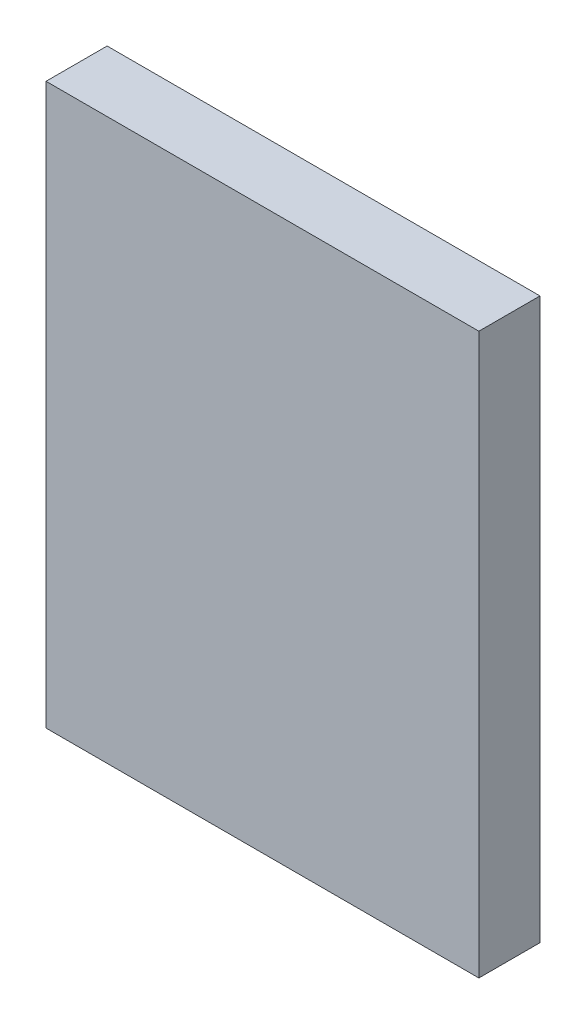
ISO-10303-21;
HEADER;
FILE_DESCRIPTION(('STEP AP214'),'2;1');
FILE_NAME('part.step','',(''),(''),'','','');
FILE_SCHEMA(('AUTOMOTIVE_DESIGN { 1 0 10303 214 1 1 1 1 }'));
ENDSEC;
DATA;
#1=APPLICATION_CONTEXT('core data for automotive mechanical design processes');
#2=APPLICATION_PROTOCOL_DEFINITION('international standard','automotive_design',2000,#1);
#3=PRODUCT_CONTEXT('',#1,'mechanical');
#4=PRODUCT('Part','Part','',(#3));
#5=PRODUCT_RELATED_PRODUCT_CATEGORY('part','',(#4));
#6=PRODUCT_DEFINITION_FORMATION('','',#4);
#7=PRODUCT_DEFINITION_CONTEXT('part definition',#1,'design');
#8=PRODUCT_DEFINITION('design','',#6,#7);
#9=PRODUCT_DEFINITION_SHAPE('','',#8);
#10=(LENGTH_UNIT() NAMED_UNIT(*) SI_UNIT(.MILLI.,.METRE.));
#11=(NAMED_UNIT(*) PLANE_ANGLE_UNIT() SI_UNIT($,.RADIAN.));
#12=(NAMED_UNIT(*) SI_UNIT($,.STERADIAN.) SOLID_ANGLE_UNIT());
#13=UNCERTAINTY_MEASURE_WITH_UNIT(LENGTH_MEASURE(1.E-05),#10,'distance_accuracy_value','');
#14=(GEOMETRIC_REPRESENTATION_CONTEXT(3) GLOBAL_UNCERTAINTY_ASSIGNED_CONTEXT((#13)) GLOBAL_UNIT_ASSIGNED_CONTEXT((#10,
#11,#12)) REPRESENTATION_CONTEXT('',''));
#15=CARTESIAN_POINT('',(0.,0.,0.));
#16=DIRECTION('',(0.,0.,1.));
#17=DIRECTION('',(1.,0.,0.));
#18=AXIS2_PLACEMENT_3D('',#15,#16,#17);
#19=CARTESIAN_POINT('',(0.,22.,2.4));
#20=DIRECTION('',(1.,0.,0.));
#21=DIRECTION('',(0.,0.,-1.));
#22=AXIS2_PLACEMENT_3D('',#19,#20,#21);
#23=PLANE('',#22);
#24=DIRECTION('',(0.,-1.,0.));
#25=VECTOR('',#24,1.);
#26=CARTESIAN_POINT('',(0.,22.,0.));
#27=LINE('',#26,#25);
#28=CARTESIAN_POINT('',(0.,22.,0.));
#29=VERTEX_POINT('',#28);
#30=CARTESIAN_POINT('',(0.,0.,0.));
#31=VERTEX_POINT('',#30);
#32=EDGE_CURVE('E115',#29,#31,#27,.T.);
#33=ORIENTED_EDGE('',*,*,#32,.T.);
#34=DIRECTION('',(0.,0.,-1.));
#35=VECTOR('',#34,1.);
#36=CARTESIAN_POINT('',(0.,0.,2.4));
#37=LINE('',#36,#35);
#38=CARTESIAN_POINT('',(0.,0.,2.4));
#39=VERTEX_POINT('',#38);
#40=EDGE_CURVE('E11',#39,#31,#37,.T.);
#41=ORIENTED_EDGE('',*,*,#40,.F.);
#42=DIRECTION('',(0.,-1.,0.));
#43=VECTOR('',#42,1.);
#44=CARTESIAN_POINT('',(0.,22.,2.4));
#45=LINE('',#44,#43);
#46=CARTESIAN_POINT('',(0.,22.,2.4));
#47=VERTEX_POINT('',#46);
#48=EDGE_CURVE('E99',#47,#39,#45,.T.);
#49=ORIENTED_EDGE('',*,*,#48,.F.);
#50=DIRECTION('',(0.,0.,-1.));
#51=VECTOR('',#50,1.);
#52=CARTESIAN_POINT('',(0.,22.,2.4));
#53=LINE('',#52,#51);
#54=EDGE_CURVE('E111',#47,#29,#53,.T.);
#55=ORIENTED_EDGE('',*,*,#54,.T.);
#56=EDGE_LOOP('',(#33,#41,#49,#55));
#57=FACE_BOUND('',#56,.T.);
#58=ADVANCED_FACE('F47',(#57),#23,.F.);
#59=CARTESIAN_POINT('',(0.,0.,2.4));
#60=DIRECTION('',(0.,1.,0.));
#61=DIRECTION('',(0.,0.,1.));
#62=AXIS2_PLACEMENT_3D('',#59,#60,#61);
#63=PLANE('',#62);
#64=DIRECTION('',(1.,0.,0.));
#65=VECTOR('',#64,1.);
#66=CARTESIAN_POINT('',(0.,0.,0.));
#67=LINE('',#66,#65);
#68=CARTESIAN_POINT('',(17.,0.,0.));
#69=VERTEX_POINT('',#68);
#70=EDGE_CURVE('E104',#31,#69,#67,.T.);
#71=ORIENTED_EDGE('',*,*,#70,.T.);
#72=DIRECTION('',(0.,0.,-1.));
#73=VECTOR('',#72,1.);
#74=CARTESIAN_POINT('',(17.,0.,2.4));
#75=LINE('',#74,#73);
#76=CARTESIAN_POINT('',(17.,0.,2.4));
#77=VERTEX_POINT('',#76);
#78=EDGE_CURVE('E56',#77,#69,#75,.T.);
#79=ORIENTED_EDGE('',*,*,#78,.F.);
#80=DIRECTION('',(1.,0.,0.));
#81=VECTOR('',#80,1.);
#82=CARTESIAN_POINT('',(0.,0.,2.4));
#83=LINE('',#82,#81);
#84=EDGE_CURVE('E94',#39,#77,#83,.T.);
#85=ORIENTED_EDGE('',*,*,#84,.F.);
#86=ORIENTED_EDGE('',*,*,#40,.T.);
#87=EDGE_LOOP('',(#71,#79,#85,#86));
#88=FACE_BOUND('',#87,.T.);
#89=ADVANCED_FACE('F103',(#88),#63,.F.);
#90=CARTESIAN_POINT('',(17.,0.,2.4));
#91=DIRECTION('',(-1.,0.,0.));
#92=DIRECTION('',(0.,0.,1.));
#93=AXIS2_PLACEMENT_3D('',#90,#91,#92);
#94=PLANE('',#93);
#95=DIRECTION('',(0.,1.,0.));
#96=VECTOR('',#95,1.);
#97=CARTESIAN_POINT('',(17.,0.,0.));
#98=LINE('',#97,#96);
#99=CARTESIAN_POINT('',(17.,22.,0.));
#100=VERTEX_POINT('',#99);
#101=EDGE_CURVE('E81',#69,#100,#98,.T.);
#102=ORIENTED_EDGE('',*,*,#101,.T.);
#103=DIRECTION('',(0.,0.,-1.));
#104=VECTOR('',#103,1.);
#105=CARTESIAN_POINT('',(17.,22.,2.4));
#106=LINE('',#105,#104);
#107=CARTESIAN_POINT('',(17.,22.,2.4));
#108=VERTEX_POINT('',#107);
#109=EDGE_CURVE('E106',#108,#100,#106,.T.);
#110=ORIENTED_EDGE('',*,*,#109,.F.);
#111=DIRECTION('',(0.,1.,0.));
#112=VECTOR('',#111,1.);
#113=CARTESIAN_POINT('',(17.,0.,2.4));
#114=LINE('',#113,#112);
#115=EDGE_CURVE('E97',#77,#108,#114,.T.);
#116=ORIENTED_EDGE('',*,*,#115,.F.);
#117=ORIENTED_EDGE('',*,*,#78,.T.);
#118=EDGE_LOOP('',(#102,#110,#116,#117));
#119=FACE_BOUND('',#118,.T.);
#120=ADVANCED_FACE('F107',(#119),#94,.F.);
#121=CARTESIAN_POINT('',(17.,22.,2.4));
#122=DIRECTION('',(0.,-1.,0.));
#123=DIRECTION('',(0.,0.,-1.));
#124=AXIS2_PLACEMENT_3D('',#121,#122,#123);
#125=PLANE('',#124);
#126=DIRECTION('',(-1.,0.,0.));
#127=VECTOR('',#126,1.);
#128=CARTESIAN_POINT('',(17.,22.,0.));
#129=LINE('',#128,#127);
#130=EDGE_CURVE('E87',#100,#29,#129,.T.);
#131=ORIENTED_EDGE('',*,*,#130,.T.);
#132=ORIENTED_EDGE('',*,*,#54,.F.);
#133=DIRECTION('',(-1.,0.,0.));
#134=VECTOR('',#133,1.);
#135=CARTESIAN_POINT('',(17.,22.,2.4));
#136=LINE('',#135,#134);
#137=EDGE_CURVE('E64',#108,#47,#136,.T.);
#138=ORIENTED_EDGE('',*,*,#137,.F.);
#139=ORIENTED_EDGE('',*,*,#109,.T.);
#140=EDGE_LOOP('',(#131,#132,#138,#139));
#141=FACE_BOUND('',#140,.T.);
#142=ADVANCED_FACE('F128',(#141),#125,.F.);
#143=CARTESIAN_POINT('',(0.,0.,2.4));
#144=DIRECTION('',(0.,0.,1.));
#145=DIRECTION('',(1.,0.,0.));
#146=AXIS2_PLACEMENT_3D('',#143,#144,#145);
#147=PLANE('',#146);
#148=ORIENTED_EDGE('',*,*,#48,.T.);
#149=ORIENTED_EDGE('',*,*,#84,.T.);
#150=ORIENTED_EDGE('',*,*,#115,.T.);
#151=ORIENTED_EDGE('',*,*,#137,.T.);
#152=EDGE_LOOP('',(#148,#149,#150,#151));
#153=FACE_BOUND('',#152,.T.);
#154=ADVANCED_FACE('F95',(#153),#147,.T.);
#155=CARTESIAN_POINT('',(0.,0.,0.));
#156=DIRECTION('',(0.,0.,1.));
#157=DIRECTION('',(1.,0.,0.));
#158=AXIS2_PLACEMENT_3D('',#155,#156,#157);
#159=PLANE('',#158);
#160=ORIENTED_EDGE('',*,*,#32,.F.);
#161=ORIENTED_EDGE('',*,*,#130,.F.);
#162=ORIENTED_EDGE('',*,*,#101,.F.);
#163=ORIENTED_EDGE('',*,*,#70,.F.);
#164=EDGE_LOOP('',(#160,#161,#162,#163));
#165=FACE_BOUND('',#164,.T.);
#166=ADVANCED_FACE('F131',(#165),#159,.F.);
#167=CLOSED_SHELL('',(#58,#89,#120,#142,#154,#166));
#168=MANIFOLD_SOLID_BREP('B2',#167);
#169=ADVANCED_BREP_SHAPE_REPRESENTATION('',(#18,#168),#14);
#170=SHAPE_DEFINITION_REPRESENTATION(#9,#169);
ENDSEC;
END-ISO-10303-21;
